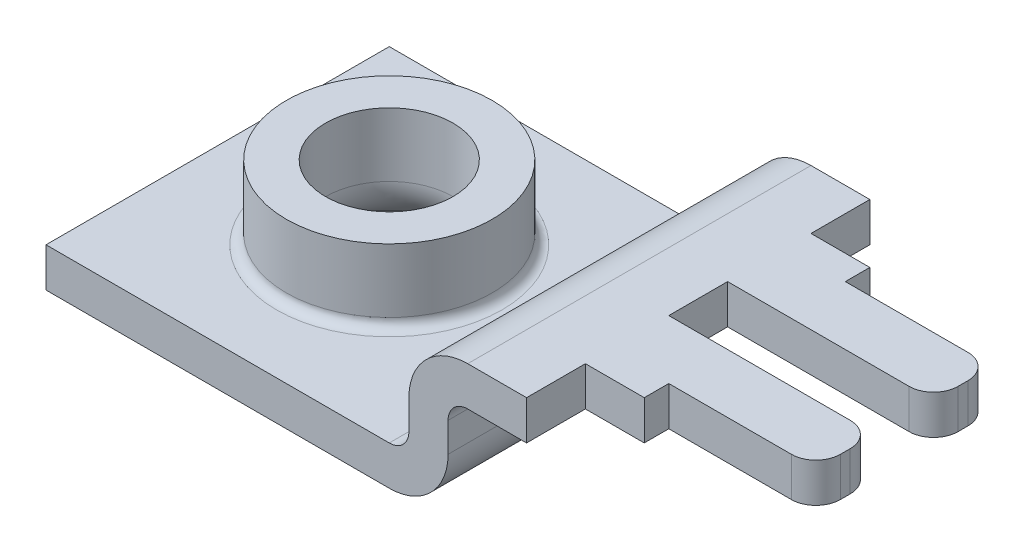
ISO-10303-21;
HEADER;
FILE_DESCRIPTION(('STEP AP214'),'2;1');
FILE_NAME('part.step','',(''),(''),'','','');
FILE_SCHEMA(('AUTOMOTIVE_DESIGN { 1 0 10303 214 1 1 1 1 }'));
ENDSEC;
DATA;
#1=APPLICATION_CONTEXT('core data for automotive mechanical design processes');
#2=APPLICATION_PROTOCOL_DEFINITION('international standard','automotive_design',2000,#1);
#3=PRODUCT_CONTEXT('',#1,'mechanical');
#4=PRODUCT('Part','Part','',(#3));
#5=PRODUCT_RELATED_PRODUCT_CATEGORY('part','',(#4));
#6=PRODUCT_DEFINITION_FORMATION('','',#4);
#7=PRODUCT_DEFINITION_CONTEXT('part definition',#1,'design');
#8=PRODUCT_DEFINITION('design','',#6,#7);
#9=PRODUCT_DEFINITION_SHAPE('','',#8);
#10=(LENGTH_UNIT() NAMED_UNIT(*) SI_UNIT(.MILLI.,.METRE.));
#11=(NAMED_UNIT(*) PLANE_ANGLE_UNIT() SI_UNIT($,.RADIAN.));
#12=(NAMED_UNIT(*) SI_UNIT($,.STERADIAN.) SOLID_ANGLE_UNIT());
#13=UNCERTAINTY_MEASURE_WITH_UNIT(LENGTH_MEASURE(1.E-05),#10,'distance_accuracy_value','');
#14=(GEOMETRIC_REPRESENTATION_CONTEXT(3) GLOBAL_UNCERTAINTY_ASSIGNED_CONTEXT((#13)) GLOBAL_UNIT_ASSIGNED_CONTEXT((#10,
#11,#12)) REPRESENTATION_CONTEXT('',''));
#15=CARTESIAN_POINT('',(0.,0.,0.));
#16=DIRECTION('',(0.,0.,1.));
#17=DIRECTION('',(1.,0.,0.));
#18=AXIS2_PLACEMENT_3D('',#15,#16,#17);
#19=CARTESIAN_POINT('',(8.19999999999999,3.,3.5));
#20=DIRECTION('',(0.,1.,0.));
#21=DIRECTION('',(0.,0.,1.));
#22=AXIS2_PLACEMENT_3D('',#19,#20,#21);
#23=PLANE('',#22);
#24=DIRECTION('',(0.,0.,1.));
#25=VECTOR('',#24,1.);
#26=CARTESIAN_POINT('',(9.79999999999998,3.,3.5));
#27=LINE('',#26,#25);
#28=CARTESIAN_POINT('',(9.79999999999998,3.,-2.3));
#29=VERTEX_POINT('',#28);
#30=CARTESIAN_POINT('',(9.79999999999998,3.,-3.5));
#31=VERTEX_POINT('',#30);
#32=EDGE_CURVE('E513',#29,#31,#27,.F.);
#33=ORIENTED_EDGE('',*,*,#32,.T.);
#34=DIRECTION('',(1.,0.,0.));
#35=VECTOR('',#34,1.);
#36=CARTESIAN_POINT('',(8.19999999999999,3.,-3.5));
#37=LINE('',#36,#35);
#38=CARTESIAN_POINT('',(8.6,3.,-3.5));
#39=VERTEX_POINT('',#38);
#40=EDGE_CURVE('E511',#31,#39,#37,.F.);
#41=ORIENTED_EDGE('',*,*,#40,.T.);
#42=DIRECTION('',(0.,0.,1.));
#43=VECTOR('',#42,1.);
#44=CARTESIAN_POINT('',(8.6,3.,-16.8071409401118));
#45=LINE('',#44,#43);
#46=CARTESIAN_POINT('',(8.6,3.,3.5));
#47=VERTEX_POINT('',#46);
#48=EDGE_CURVE('E507',#47,#39,#45,.F.);
#49=ORIENTED_EDGE('',*,*,#48,.F.);
#50=DIRECTION('',(1.,0.,0.));
#51=VECTOR('',#50,1.);
#52=CARTESIAN_POINT('',(8.19999999999999,3.,3.5));
#53=LINE('',#52,#51);
#54=CARTESIAN_POINT('',(9.79999999999998,3.,3.5));
#55=VERTEX_POINT('',#54);
#56=EDGE_CURVE('E171',#47,#55,#53,.T.);
#57=ORIENTED_EDGE('',*,*,#56,.T.);
#58=DIRECTION('',(0.,0.,1.));
#59=VECTOR('',#58,1.);
#60=CARTESIAN_POINT('',(9.79999999999998,3.,3.5));
#61=LINE('',#60,#59);
#62=CARTESIAN_POINT('',(9.79999999999998,3.,2.3));
#63=VERTEX_POINT('',#62);
#64=EDGE_CURVE('E443',#55,#63,#61,.F.);
#65=ORIENTED_EDGE('',*,*,#64,.T.);
#66=DIRECTION('',(-1.,0.,0.));
#67=VECTOR('',#66,1.);
#68=CARTESIAN_POINT('',(8.19999999999999,3.,2.3));
#69=LINE('',#68,#67);
#70=CARTESIAN_POINT('',(11.,3.,2.3));
#71=VERTEX_POINT('',#70);
#72=EDGE_CURVE('E433',#63,#71,#69,.F.);
#73=ORIENTED_EDGE('',*,*,#72,.T.);
#74=DIRECTION('',(0.,0.,1.));
#75=VECTOR('',#74,1.);
#76=CARTESIAN_POINT('',(11.,3.,3.5));
#77=LINE('',#76,#75);
#78=CARTESIAN_POINT('',(11.,3.,1.8));
#79=VERTEX_POINT('',#78);
#80=EDGE_CURVE('E422',#71,#79,#77,.F.);
#81=ORIENTED_EDGE('',*,*,#80,.T.);
#82=DIRECTION('',(-1.,0.,0.));
#83=VECTOR('',#82,1.);
#84=CARTESIAN_POINT('',(8.19999999999999,3.,1.8));
#85=LINE('',#84,#83);
#86=CARTESIAN_POINT('',(13.5,3.,1.8));
#87=VERTEX_POINT('',#86);
#88=EDGE_CURVE('E421',#79,#87,#85,.F.);
#89=ORIENTED_EDGE('',*,*,#88,.T.);
#90=CARTESIAN_POINT('',(13.5,3.,1.3));
#91=DIRECTION('',(0.,1.,0.));
#92=DIRECTION('',(0.,0.,1.));
#93=AXIS2_PLACEMENT_3D('',#90,#91,#92);
#94=CIRCLE('',#93,0.5);
#95=CARTESIAN_POINT('',(14.,3.,1.3));
#96=VERTEX_POINT('',#95);
#97=EDGE_CURVE('E417',#96,#87,#94,.F.);
#98=ORIENTED_EDGE('',*,*,#97,.F.);
#99=DIRECTION('',(0.,0.,-1.));
#100=VECTOR('',#99,1.);
#101=CARTESIAN_POINT('',(14.,3.,3.5));
#102=LINE('',#101,#100);
#103=CARTESIAN_POINT('',(14.,3.,1.1));
#104=VERTEX_POINT('',#103);
#105=EDGE_CURVE('E414',#104,#96,#102,.F.);
#106=ORIENTED_EDGE('',*,*,#105,.F.);
#107=CARTESIAN_POINT('',(13.5,3.,1.1));
#108=DIRECTION('',(0.,1.,0.));
#109=DIRECTION('',(0.,0.,1.));
#110=AXIS2_PLACEMENT_3D('',#107,#108,#109);
#111=CIRCLE('',#110,0.5);
#112=CARTESIAN_POINT('',(13.5,3.,0.600000000000002));
#113=VERTEX_POINT('',#112);
#114=EDGE_CURVE('E411',#113,#104,#111,.F.);
#115=ORIENTED_EDGE('',*,*,#114,.F.);
#116=DIRECTION('',(1.,0.,0.));
#117=VECTOR('',#116,1.);
#118=CARTESIAN_POINT('',(8.19999999999999,3.,0.600000000000003));
#119=LINE('',#118,#117);
#120=CARTESIAN_POINT('',(9.79999999999998,3.,0.600000000000003));
#121=VERTEX_POINT('',#120);
#122=EDGE_CURVE('E403',#113,#121,#119,.F.);
#123=ORIENTED_EDGE('',*,*,#122,.T.);
#124=DIRECTION('',(0.,0.,1.));
#125=VECTOR('',#124,1.);
#126=CARTESIAN_POINT('',(9.79999999999998,3.,3.5));
#127=LINE('',#126,#125);
#128=CARTESIAN_POINT('',(9.79999999999998,3.,-0.600000000000003));
#129=VERTEX_POINT('',#128);
#130=EDGE_CURVE('E393',#121,#129,#127,.F.);
#131=ORIENTED_EDGE('',*,*,#130,.T.);
#132=DIRECTION('',(-1.,0.,0.));
#133=VECTOR('',#132,1.);
#134=CARTESIAN_POINT('',(8.19999999999999,3.,-0.600000000000003));
#135=LINE('',#134,#133);
#136=CARTESIAN_POINT('',(13.5,3.,-0.600000000000003));
#137=VERTEX_POINT('',#136);
#138=EDGE_CURVE('E392',#129,#137,#135,.F.);
#139=ORIENTED_EDGE('',*,*,#138,.T.);
#140=CARTESIAN_POINT('',(13.5,3.,-1.1));
#141=DIRECTION('',(0.,1.,0.));
#142=DIRECTION('',(0.,0.,1.));
#143=AXIS2_PLACEMENT_3D('',#140,#141,#142);
#144=CIRCLE('',#143,0.5);
#145=CARTESIAN_POINT('',(14.,3.,-1.1));
#146=VERTEX_POINT('',#145);
#147=EDGE_CURVE('E388',#146,#137,#144,.F.);
#148=ORIENTED_EDGE('',*,*,#147,.F.);
#149=DIRECTION('',(0.,0.,-1.));
#150=VECTOR('',#149,1.);
#151=CARTESIAN_POINT('',(14.,3.,3.5));
#152=LINE('',#151,#150);
#153=CARTESIAN_POINT('',(14.,3.,-1.3));
#154=VERTEX_POINT('',#153);
#155=EDGE_CURVE('E385',#154,#146,#152,.F.);
#156=ORIENTED_EDGE('',*,*,#155,.F.);
#157=CARTESIAN_POINT('',(13.5,3.,-1.3));
#158=DIRECTION('',(0.,1.,0.));
#159=DIRECTION('',(0.,0.,1.));
#160=AXIS2_PLACEMENT_3D('',#157,#158,#159);
#161=CIRCLE('',#160,0.5);
#162=CARTESIAN_POINT('',(13.5,3.,-1.8));
#163=VERTEX_POINT('',#162);
#164=EDGE_CURVE('E382',#163,#154,#161,.F.);
#165=ORIENTED_EDGE('',*,*,#164,.F.);
#166=DIRECTION('',(1.,0.,0.));
#167=VECTOR('',#166,1.);
#168=CARTESIAN_POINT('',(8.19999999999999,3.,-1.8));
#169=LINE('',#168,#167);
#170=CARTESIAN_POINT('',(11.,3.,-1.8));
#171=VERTEX_POINT('',#170);
#172=EDGE_CURVE('E369',#163,#171,#169,.F.);
#173=ORIENTED_EDGE('',*,*,#172,.T.);
#174=DIRECTION('',(0.,0.,1.));
#175=VECTOR('',#174,1.);
#176=CARTESIAN_POINT('',(11.,3.,3.5));
#177=LINE('',#176,#175);
#178=CARTESIAN_POINT('',(11.,3.,-2.3));
#179=VERTEX_POINT('',#178);
#180=EDGE_CURVE('E471',#171,#179,#177,.F.);
#181=ORIENTED_EDGE('',*,*,#180,.T.);
#182=DIRECTION('',(1.,0.,0.));
#183=VECTOR('',#182,1.);
#184=CARTESIAN_POINT('',(8.19999999999999,3.,-2.3));
#185=LINE('',#184,#183);
#186=EDGE_CURVE('E474',#179,#29,#185,.F.);
#187=ORIENTED_EDGE('',*,*,#186,.T.);
#188=EDGE_LOOP('',(#33,#41,#49,#57,#65,#73,#81,#89,#98,#106,#115,#123,#131,#139,#148,#156,#165,
#173,#181,#187));
#189=FACE_BOUND('',#188,.T.);
#190=ADVANCED_FACE('F17',(#189),#23,.T.);
#191=CARTESIAN_POINT('',(8.6,1.8,-16.8071409401118));
#192=DIRECTION('',(0.,0.,1.));
#193=DIRECTION('',(1.,0.,0.));
#194=AXIS2_PLACEMENT_3D('',#191,#192,#193);
#195=CYLINDRICAL_SURFACE('',#194,1.2);
#196=CARTESIAN_POINT('',(8.6,1.8,-3.5));
#197=DIRECTION('',(0.,0.,1.));
#198=DIRECTION('',(1.,0.,0.));
#199=AXIS2_PLACEMENT_3D('',#196,#197,#198);
#200=CIRCLE('',#199,1.2);
#201=CARTESIAN_POINT('',(7.40000000000001,1.8,-3.5));
#202=VERTEX_POINT('',#201);
#203=EDGE_CURVE('E464',#39,#202,#200,.T.);
#204=ORIENTED_EDGE('',*,*,#203,.T.);
#205=DIRECTION('',(0.,0.,1.));
#206=VECTOR('',#205,1.);
#207=CARTESIAN_POINT('',(7.40000000000002,1.8,3.5));
#208=LINE('',#207,#206);
#209=CARTESIAN_POINT('',(7.40000000000001,1.8,3.5));
#210=VERTEX_POINT('',#209);
#211=EDGE_CURVE('E361',#210,#202,#208,.F.);
#212=ORIENTED_EDGE('',*,*,#211,.F.);
#213=CARTESIAN_POINT('',(8.6,1.8,3.49999999999999));
#214=DIRECTION('',(0.,0.,1.));
#215=DIRECTION('',(1.,0.,0.));
#216=AXIS2_PLACEMENT_3D('',#213,#214,#215);
#217=CIRCLE('',#216,1.2);
#218=EDGE_CURVE('E510',#210,#47,#217,.F.);
#219=ORIENTED_EDGE('',*,*,#218,.T.);
#220=ORIENTED_EDGE('',*,*,#48,.T.);
#221=EDGE_LOOP('',(#204,#212,#219,#220));
#222=FACE_BOUND('',#221,.T.);
#223=ADVANCED_FACE('F566',(#222),#195,.T.);
#224=CARTESIAN_POINT('',(9.79999999999998,-14.6816288842403,3.5));
#225=DIRECTION('',(-1.,0.,0.));
#226=DIRECTION('',(0.,0.,1.));
#227=AXIS2_PLACEMENT_3D('',#224,#225,#226);
#228=PLANE('',#227);
#229=DIRECTION('',(0.,1.,0.));
#230=VECTOR('',#229,1.);
#231=CARTESIAN_POINT('',(9.79999999999998,-14.6816288842403,3.5));
#232=LINE('',#231,#230);
#233=CARTESIAN_POINT('',(9.79999999999998,2.19999999999999,3.5));
#234=VERTEX_POINT('',#233);
#235=EDGE_CURVE('E450',#234,#55,#232,.T.);
#236=ORIENTED_EDGE('',*,*,#235,.F.);
#237=DIRECTION('',(0.,0.,1.));
#238=VECTOR('',#237,1.);
#239=CARTESIAN_POINT('',(9.79999999999998,2.19999999999999,3.5));
#240=LINE('',#239,#238);
#241=CARTESIAN_POINT('',(9.79999999999998,2.19999999999999,2.3));
#242=VERTEX_POINT('',#241);
#243=EDGE_CURVE('E358',#234,#242,#240,.F.);
#244=ORIENTED_EDGE('',*,*,#243,.T.);
#245=DIRECTION('',(0.,1.,0.));
#246=VECTOR('',#245,1.);
#247=CARTESIAN_POINT('',(9.79999999999998,-14.6816288842403,2.3));
#248=LINE('',#247,#246);
#249=EDGE_CURVE('E440',#242,#63,#248,.T.);
#250=ORIENTED_EDGE('',*,*,#249,.T.);
#251=ORIENTED_EDGE('',*,*,#64,.F.);
#252=EDGE_LOOP('',(#236,#244,#250,#251));
#253=FACE_BOUND('',#252,.T.);
#254=ADVANCED_FACE('F635',(#253),#228,.F.);
#255=CARTESIAN_POINT('',(8.19999999999999,-14.6816288842403,2.3));
#256=DIRECTION('',(0.,0.,-1.));
#257=DIRECTION('',(-1.,0.,0.));
#258=AXIS2_PLACEMENT_3D('',#255,#256,#257);
#259=PLANE('',#258);
#260=ORIENTED_EDGE('',*,*,#249,.F.);
#261=DIRECTION('',(1.,0.,0.));
#262=VECTOR('',#261,1.);
#263=CARTESIAN_POINT('',(8.19999999999999,2.19999999999999,2.3));
#264=LINE('',#263,#262);
#265=CARTESIAN_POINT('',(11.,2.19999999999999,2.3));
#266=VERTEX_POINT('',#265);
#267=EDGE_CURVE('E427',#242,#266,#264,.T.);
#268=ORIENTED_EDGE('',*,*,#267,.T.);
#269=DIRECTION('',(0.,1.,0.));
#270=VECTOR('',#269,1.);
#271=CARTESIAN_POINT('',(11.,-14.6816288842403,2.3));
#272=LINE('',#271,#270);
#273=EDGE_CURVE('E430',#266,#71,#272,.T.);
#274=ORIENTED_EDGE('',*,*,#273,.T.);
#275=ORIENTED_EDGE('',*,*,#72,.F.);
#276=EDGE_LOOP('',(#260,#268,#274,#275));
#277=FACE_BOUND('',#276,.T.);
#278=ADVANCED_FACE('F629',(#277),#259,.F.);
#279=CARTESIAN_POINT('',(11.,-14.6816288842403,3.5));
#280=DIRECTION('',(-1.,0.,0.));
#281=DIRECTION('',(0.,0.,1.));
#282=AXIS2_PLACEMENT_3D('',#279,#280,#281);
#283=PLANE('',#282);
#284=ORIENTED_EDGE('',*,*,#273,.F.);
#285=DIRECTION('',(0.,0.,1.));
#286=VECTOR('',#285,1.);
#287=CARTESIAN_POINT('',(11.,2.19999999999999,3.5));
#288=LINE('',#287,#286);
#289=CARTESIAN_POINT('',(11.,2.19999999999999,1.8));
#290=VERTEX_POINT('',#289);
#291=EDGE_CURVE('E347',#266,#290,#288,.F.);
#292=ORIENTED_EDGE('',*,*,#291,.T.);
#293=DIRECTION('',(0.,1.,0.));
#294=VECTOR('',#293,1.);
#295=CARTESIAN_POINT('',(11.,-14.6816288842403,1.8));
#296=LINE('',#295,#294);
#297=EDGE_CURVE('E418',#290,#79,#296,.T.);
#298=ORIENTED_EDGE('',*,*,#297,.T.);
#299=ORIENTED_EDGE('',*,*,#80,.F.);
#300=EDGE_LOOP('',(#284,#292,#298,#299));
#301=FACE_BOUND('',#300,.T.);
#302=ADVANCED_FACE('F736',(#301),#283,.F.);
#303=CARTESIAN_POINT('',(8.19999999999999,-14.6816288842403,1.8));
#304=DIRECTION('',(0.,0.,-1.));
#305=DIRECTION('',(-1.,0.,0.));
#306=AXIS2_PLACEMENT_3D('',#303,#304,#305);
#307=PLANE('',#306);
#308=ORIENTED_EDGE('',*,*,#297,.F.);
#309=DIRECTION('',(1.,0.,0.));
#310=VECTOR('',#309,1.);
#311=CARTESIAN_POINT('',(8.19999999999999,2.19999999999999,1.8));
#312=LINE('',#311,#310);
#313=CARTESIAN_POINT('',(13.5,2.19999999999999,1.8));
#314=VERTEX_POINT('',#313);
#315=EDGE_CURVE('E344',#290,#314,#312,.T.);
#316=ORIENTED_EDGE('',*,*,#315,.T.);
#317=DIRECTION('',(0.,1.,0.));
#318=VECTOR('',#317,1.);
#319=CARTESIAN_POINT('',(13.5,-14.6816288842403,1.8));
#320=LINE('',#319,#318);
#321=EDGE_CURVE('E415',#87,#314,#320,.F.);
#322=ORIENTED_EDGE('',*,*,#321,.F.);
#323=ORIENTED_EDGE('',*,*,#88,.F.);
#324=EDGE_LOOP('',(#308,#316,#322,#323));
#325=FACE_BOUND('',#324,.T.);
#326=ADVANCED_FACE('F732',(#325),#307,.F.);
#327=CARTESIAN_POINT('',(13.5,-14.6816288842403,1.3));
#328=DIRECTION('',(0.,1.,0.));
#329=DIRECTION('',(0.,0.,1.));
#330=AXIS2_PLACEMENT_3D('',#327,#328,#329);
#331=CYLINDRICAL_SURFACE('',#330,0.5);
#332=CARTESIAN_POINT('',(13.5,2.19999999999999,1.3));
#333=DIRECTION('',(0.,1.,0.));
#334=DIRECTION('',(0.,0.,1.));
#335=AXIS2_PLACEMENT_3D('',#332,#333,#334);
#336=CIRCLE('',#335,0.5);
#337=CARTESIAN_POINT('',(14.,2.19999999999999,1.3));
#338=VERTEX_POINT('',#337);
#339=EDGE_CURVE('E343',#314,#338,#336,.T.);
#340=ORIENTED_EDGE('',*,*,#339,.T.);
#341=DIRECTION('',(0.,1.,0.));
#342=VECTOR('',#341,1.);
#343=CARTESIAN_POINT('',(14.,-14.6816288842403,1.3));
#344=LINE('',#343,#342);
#345=EDGE_CURVE('E412',#96,#338,#344,.F.);
#346=ORIENTED_EDGE('',*,*,#345,.F.);
#347=ORIENTED_EDGE('',*,*,#97,.T.);
#348=ORIENTED_EDGE('',*,*,#321,.T.);
#349=EDGE_LOOP('',(#340,#346,#347,#348));
#350=FACE_BOUND('',#349,.T.);
#351=ADVANCED_FACE('F728',(#350),#331,.T.);
#352=CARTESIAN_POINT('',(14.,-14.6816288842403,3.5));
#353=DIRECTION('',(1.,0.,0.));
#354=DIRECTION('',(0.,0.,-1.));
#355=AXIS2_PLACEMENT_3D('',#352,#353,#354);
#356=PLANE('',#355);
#357=ORIENTED_EDGE('',*,*,#345,.T.);
#358=DIRECTION('',(0.,0.,1.));
#359=VECTOR('',#358,1.);
#360=CARTESIAN_POINT('',(14.,2.19999999999999,3.5));
#361=LINE('',#360,#359);
#362=CARTESIAN_POINT('',(14.,2.19999999999999,1.1));
#363=VERTEX_POINT('',#362);
#364=EDGE_CURVE('E340',#338,#363,#361,.F.);
#365=ORIENTED_EDGE('',*,*,#364,.T.);
#366=DIRECTION('',(0.,1.,0.));
#367=VECTOR('',#366,1.);
#368=CARTESIAN_POINT('',(14.,-14.6816288842403,1.1));
#369=LINE('',#368,#367);
#370=EDGE_CURVE('E409',#104,#363,#369,.F.);
#371=ORIENTED_EDGE('',*,*,#370,.F.);
#372=ORIENTED_EDGE('',*,*,#105,.T.);
#373=EDGE_LOOP('',(#357,#365,#371,#372));
#374=FACE_BOUND('',#373,.T.);
#375=ADVANCED_FACE('F724',(#374),#356,.T.);
#376=CARTESIAN_POINT('',(13.5,-14.6816288842403,1.1));
#377=DIRECTION('',(0.,1.,0.));
#378=DIRECTION('',(0.,0.,1.));
#379=AXIS2_PLACEMENT_3D('',#376,#377,#378);
#380=CYLINDRICAL_SURFACE('',#379,0.5);
#381=CARTESIAN_POINT('',(13.5,2.19999999999999,1.1));
#382=DIRECTION('',(0.,1.,0.));
#383=DIRECTION('',(0.,0.,1.));
#384=AXIS2_PLACEMENT_3D('',#381,#382,#383);
#385=CIRCLE('',#384,0.5);
#386=CARTESIAN_POINT('',(13.5,2.19999999999999,0.600000000000003));
#387=VERTEX_POINT('',#386);
#388=EDGE_CURVE('E337',#363,#387,#385,.T.);
#389=ORIENTED_EDGE('',*,*,#388,.T.);
#390=DIRECTION('',(0.,1.,0.));
#391=VECTOR('',#390,1.);
#392=CARTESIAN_POINT('',(13.5,-14.6816288842403,0.600000000000002));
#393=LINE('',#392,#391);
#394=EDGE_CURVE('E406',#387,#113,#393,.T.);
#395=ORIENTED_EDGE('',*,*,#394,.T.);
#396=ORIENTED_EDGE('',*,*,#114,.T.);
#397=ORIENTED_EDGE('',*,*,#370,.T.);
#398=EDGE_LOOP('',(#389,#395,#396,#397));
#399=FACE_BOUND('',#398,.T.);
#400=ADVANCED_FACE('F720',(#399),#380,.T.);
#401=CARTESIAN_POINT('',(8.19999999999999,-14.6816288842403,0.600000000000003));
#402=DIRECTION('',(0.,0.,1.));
#403=DIRECTION('',(1.,0.,0.));
#404=AXIS2_PLACEMENT_3D('',#401,#402,#403);
#405=PLANE('',#404);
#406=ORIENTED_EDGE('',*,*,#394,.F.);
#407=DIRECTION('',(1.,0.,0.));
#408=VECTOR('',#407,1.);
#409=CARTESIAN_POINT('',(8.19999999999999,2.19999999999999,0.600000000000003));
#410=LINE('',#409,#408);
#411=CARTESIAN_POINT('',(9.79999999999998,2.19999999999999,0.600000000000003));
#412=VERTEX_POINT('',#411);
#413=EDGE_CURVE('E334',#387,#412,#410,.F.);
#414=ORIENTED_EDGE('',*,*,#413,.T.);
#415=DIRECTION('',(0.,1.,0.));
#416=VECTOR('',#415,1.);
#417=CARTESIAN_POINT('',(9.79999999999998,-14.6816288842403,0.600000000000003));
#418=LINE('',#417,#416);
#419=EDGE_CURVE('E400',#412,#121,#418,.T.);
#420=ORIENTED_EDGE('',*,*,#419,.T.);
#421=ORIENTED_EDGE('',*,*,#122,.F.);
#422=EDGE_LOOP('',(#406,#414,#420,#421));
#423=FACE_BOUND('',#422,.T.);
#424=ADVANCED_FACE('F716',(#423),#405,.F.);
#425=CARTESIAN_POINT('',(9.79999999999998,-14.6816288842403,3.5));
#426=DIRECTION('',(-1.,0.,0.));
#427=DIRECTION('',(0.,0.,1.));
#428=AXIS2_PLACEMENT_3D('',#425,#426,#427);
#429=PLANE('',#428);
#430=ORIENTED_EDGE('',*,*,#419,.F.);
#431=DIRECTION('',(0.,0.,1.));
#432=VECTOR('',#431,1.);
#433=CARTESIAN_POINT('',(9.79999999999998,2.19999999999999,3.5));
#434=LINE('',#433,#432);
#435=CARTESIAN_POINT('',(9.79999999999998,2.19999999999999,-0.600000000000003));
#436=VERTEX_POINT('',#435);
#437=EDGE_CURVE('E331',#412,#436,#434,.F.);
#438=ORIENTED_EDGE('',*,*,#437,.T.);
#439=DIRECTION('',(0.,1.,0.));
#440=VECTOR('',#439,1.);
#441=CARTESIAN_POINT('',(9.79999999999998,-14.6816288842403,-0.600000000000003));
#442=LINE('',#441,#440);
#443=EDGE_CURVE('E389',#436,#129,#442,.T.);
#444=ORIENTED_EDGE('',*,*,#443,.T.);
#445=ORIENTED_EDGE('',*,*,#130,.F.);
#446=EDGE_LOOP('',(#430,#438,#444,#445));
#447=FACE_BOUND('',#446,.T.);
#448=ADVANCED_FACE('F712',(#447),#429,.F.);
#449=CARTESIAN_POINT('',(8.19999999999999,-14.6816288842403,-0.600000000000003));
#450=DIRECTION('',(0.,0.,-1.));
#451=DIRECTION('',(-1.,0.,0.));
#452=AXIS2_PLACEMENT_3D('',#449,#450,#451);
#453=PLANE('',#452);
#454=ORIENTED_EDGE('',*,*,#443,.F.);
#455=DIRECTION('',(1.,0.,0.));
#456=VECTOR('',#455,1.);
#457=CARTESIAN_POINT('',(8.19999999999999,2.19999999999999,-0.600000000000003));
#458=LINE('',#457,#456);
#459=CARTESIAN_POINT('',(13.5,2.19999999999999,-0.600000000000004));
#460=VERTEX_POINT('',#459);
#461=EDGE_CURVE('E328',#436,#460,#458,.T.);
#462=ORIENTED_EDGE('',*,*,#461,.T.);
#463=DIRECTION('',(0.,1.,0.));
#464=VECTOR('',#463,1.);
#465=CARTESIAN_POINT('',(13.5,-14.6816288842403,-0.600000000000004));
#466=LINE('',#465,#464);
#467=EDGE_CURVE('E386',#137,#460,#466,.F.);
#468=ORIENTED_EDGE('',*,*,#467,.F.);
#469=ORIENTED_EDGE('',*,*,#138,.F.);
#470=EDGE_LOOP('',(#454,#462,#468,#469));
#471=FACE_BOUND('',#470,.T.);
#472=ADVANCED_FACE('F708',(#471),#453,.F.);
#473=CARTESIAN_POINT('',(13.5,-14.6816288842403,-1.1));
#474=DIRECTION('',(0.,1.,0.));
#475=DIRECTION('',(0.,0.,1.));
#476=AXIS2_PLACEMENT_3D('',#473,#474,#475);
#477=CYLINDRICAL_SURFACE('',#476,0.5);
#478=CARTESIAN_POINT('',(13.5,2.19999999999999,-1.1));
#479=DIRECTION('',(0.,1.,0.));
#480=DIRECTION('',(0.,0.,1.));
#481=AXIS2_PLACEMENT_3D('',#478,#479,#480);
#482=CIRCLE('',#481,0.5);
#483=CARTESIAN_POINT('',(14.,2.19999999999999,-1.1));
#484=VERTEX_POINT('',#483);
#485=EDGE_CURVE('E327',#460,#484,#482,.T.);
#486=ORIENTED_EDGE('',*,*,#485,.T.);
#487=DIRECTION('',(0.,1.,0.));
#488=VECTOR('',#487,1.);
#489=CARTESIAN_POINT('',(14.,-14.6816288842403,-1.1));
#490=LINE('',#489,#488);
#491=EDGE_CURVE('E383',#146,#484,#490,.F.);
#492=ORIENTED_EDGE('',*,*,#491,.F.);
#493=ORIENTED_EDGE('',*,*,#147,.T.);
#494=ORIENTED_EDGE('',*,*,#467,.T.);
#495=EDGE_LOOP('',(#486,#492,#493,#494));
#496=FACE_BOUND('',#495,.T.);
#497=ADVANCED_FACE('F704',(#496),#477,.T.);
#498=CARTESIAN_POINT('',(14.,-14.6816288842403,3.5));
#499=DIRECTION('',(1.,0.,0.));
#500=DIRECTION('',(0.,0.,-1.));
#501=AXIS2_PLACEMENT_3D('',#498,#499,#500);
#502=PLANE('',#501);
#503=ORIENTED_EDGE('',*,*,#491,.T.);
#504=DIRECTION('',(0.,0.,1.));
#505=VECTOR('',#504,1.);
#506=CARTESIAN_POINT('',(14.,2.19999999999999,3.5));
#507=LINE('',#506,#505);
#508=CARTESIAN_POINT('',(14.,2.19999999999999,-1.3));
#509=VERTEX_POINT('',#508);
#510=EDGE_CURVE('E324',#484,#509,#507,.F.);
#511=ORIENTED_EDGE('',*,*,#510,.T.);
#512=DIRECTION('',(0.,1.,0.));
#513=VECTOR('',#512,1.);
#514=CARTESIAN_POINT('',(14.,-14.6816288842403,-1.3));
#515=LINE('',#514,#513);
#516=EDGE_CURVE('E370',#154,#509,#515,.F.);
#517=ORIENTED_EDGE('',*,*,#516,.F.);
#518=ORIENTED_EDGE('',*,*,#155,.T.);
#519=EDGE_LOOP('',(#503,#511,#517,#518));
#520=FACE_BOUND('',#519,.T.);
#521=ADVANCED_FACE('F700',(#520),#502,.T.);
#522=CARTESIAN_POINT('',(13.5,-14.6816288842403,-1.3));
#523=DIRECTION('',(0.,1.,0.));
#524=DIRECTION('',(0.,0.,1.));
#525=AXIS2_PLACEMENT_3D('',#522,#523,#524);
#526=CYLINDRICAL_SURFACE('',#525,0.5);
#527=CARTESIAN_POINT('',(13.5,2.19999999999999,-1.3));
#528=DIRECTION('',(0.,1.,0.));
#529=DIRECTION('',(0.,0.,1.));
#530=AXIS2_PLACEMENT_3D('',#527,#528,#529);
#531=CIRCLE('',#530,0.5);
#532=CARTESIAN_POINT('',(13.5,2.19999999999999,-1.8));
#533=VERTEX_POINT('',#532);
#534=EDGE_CURVE('E321',#509,#533,#531,.T.);
#535=ORIENTED_EDGE('',*,*,#534,.T.);
#536=DIRECTION('',(0.,1.,0.));
#537=VECTOR('',#536,1.);
#538=CARTESIAN_POINT('',(13.5,-14.6816288842403,-1.8));
#539=LINE('',#538,#537);
#540=EDGE_CURVE('E366',#533,#163,#539,.T.);
#541=ORIENTED_EDGE('',*,*,#540,.T.);
#542=ORIENTED_EDGE('',*,*,#164,.T.);
#543=ORIENTED_EDGE('',*,*,#516,.T.);
#544=EDGE_LOOP('',(#535,#541,#542,#543));
#545=FACE_BOUND('',#544,.T.);
#546=ADVANCED_FACE('F696',(#545),#526,.T.);
#547=CARTESIAN_POINT('',(8.19999999999999,-14.6816288842403,-1.8));
#548=DIRECTION('',(0.,0.,1.));
#549=DIRECTION('',(1.,0.,0.));
#550=AXIS2_PLACEMENT_3D('',#547,#548,#549);
#551=PLANE('',#550);
#552=ORIENTED_EDGE('',*,*,#540,.F.);
#553=DIRECTION('',(1.,0.,0.));
#554=VECTOR('',#553,1.);
#555=CARTESIAN_POINT('',(8.19999999999999,2.19999999999999,-1.8));
#556=LINE('',#555,#554);
#557=CARTESIAN_POINT('',(11.,2.19999999999999,-1.8));
#558=VERTEX_POINT('',#557);
#559=EDGE_CURVE('E318',#533,#558,#556,.F.);
#560=ORIENTED_EDGE('',*,*,#559,.T.);
#561=DIRECTION('',(0.,1.,0.));
#562=VECTOR('',#561,1.);
#563=CARTESIAN_POINT('',(11.,-14.6816288842403,-1.8));
#564=LINE('',#563,#562);
#565=EDGE_CURVE('E375',#558,#171,#564,.T.);
#566=ORIENTED_EDGE('',*,*,#565,.T.);
#567=ORIENTED_EDGE('',*,*,#172,.F.);
#568=EDGE_LOOP('',(#552,#560,#566,#567));
#569=FACE_BOUND('',#568,.T.);
#570=ADVANCED_FACE('F692',(#569),#551,.F.);
#571=CARTESIAN_POINT('',(11.,-14.6816288842403,3.5));
#572=DIRECTION('',(-1.,0.,0.));
#573=DIRECTION('',(0.,0.,1.));
#574=AXIS2_PLACEMENT_3D('',#571,#572,#573);
#575=PLANE('',#574);
#576=ORIENTED_EDGE('',*,*,#565,.F.);
#577=DIRECTION('',(0.,0.,1.));
#578=VECTOR('',#577,1.);
#579=CARTESIAN_POINT('',(11.,2.19999999999999,3.5));
#580=LINE('',#579,#578);
#581=CARTESIAN_POINT('',(11.,2.19999999999999,-2.3));
#582=VERTEX_POINT('',#581);
#583=EDGE_CURVE('E317',#558,#582,#580,.F.);
#584=ORIENTED_EDGE('',*,*,#583,.T.);
#585=DIRECTION('',(0.,1.,0.));
#586=VECTOR('',#585,1.);
#587=CARTESIAN_POINT('',(11.,-14.6816288842403,-2.3));
#588=LINE('',#587,#586);
#589=EDGE_CURVE('E378',#582,#179,#588,.T.);
#590=ORIENTED_EDGE('',*,*,#589,.T.);
#591=ORIENTED_EDGE('',*,*,#180,.F.);
#592=EDGE_LOOP('',(#576,#584,#590,#591));
#593=FACE_BOUND('',#592,.T.);
#594=ADVANCED_FACE('F688',(#593),#575,.F.);
#595=CARTESIAN_POINT('',(8.19999999999999,-14.6816288842403,-2.3));
#596=DIRECTION('',(0.,0.,1.));
#597=DIRECTION('',(1.,0.,0.));
#598=AXIS2_PLACEMENT_3D('',#595,#596,#597);
#599=PLANE('',#598);
#600=ORIENTED_EDGE('',*,*,#589,.F.);
#601=DIRECTION('',(1.,0.,0.));
#602=VECTOR('',#601,1.);
#603=CARTESIAN_POINT('',(8.19999999999999,2.19999999999999,-2.3));
#604=LINE('',#603,#602);
#605=CARTESIAN_POINT('',(9.79999999999998,2.19999999999999,-2.3));
#606=VERTEX_POINT('',#605);
#607=EDGE_CURVE('E314',#582,#606,#604,.F.);
#608=ORIENTED_EDGE('',*,*,#607,.T.);
#609=DIRECTION('',(0.,1.,0.));
#610=VECTOR('',#609,1.);
#611=CARTESIAN_POINT('',(9.79999999999998,-14.6816288842403,-2.3));
#612=LINE('',#611,#610);
#613=EDGE_CURVE('E518',#606,#29,#612,.T.);
#614=ORIENTED_EDGE('',*,*,#613,.T.);
#615=ORIENTED_EDGE('',*,*,#186,.F.);
#616=EDGE_LOOP('',(#600,#608,#614,#615));
#617=FACE_BOUND('',#616,.T.);
#618=ADVANCED_FACE('F684',(#617),#599,.F.);
#619=CARTESIAN_POINT('',(9.79999999999998,-14.6816288842403,3.5));
#620=DIRECTION('',(-1.,0.,0.));
#621=DIRECTION('',(0.,0.,1.));
#622=AXIS2_PLACEMENT_3D('',#619,#620,#621);
#623=PLANE('',#622);
#624=ORIENTED_EDGE('',*,*,#613,.F.);
#625=DIRECTION('',(0.,0.,1.));
#626=VECTOR('',#625,1.);
#627=CARTESIAN_POINT('',(9.79999999999998,2.19999999999999,3.5));
#628=LINE('',#627,#626);
#629=CARTESIAN_POINT('',(9.79999999999998,2.19999999999999,-3.5));
#630=VERTEX_POINT('',#629);
#631=EDGE_CURVE('E305',#606,#630,#628,.F.);
#632=ORIENTED_EDGE('',*,*,#631,.T.);
#633=DIRECTION('',(0.,1.,0.));
#634=VECTOR('',#633,1.);
#635=CARTESIAN_POINT('',(9.79999999999998,-14.6816288842403,-3.5));
#636=LINE('',#635,#634);
#637=EDGE_CURVE('E453',#630,#31,#636,.T.);
#638=ORIENTED_EDGE('',*,*,#637,.T.);
#639=ORIENTED_EDGE('',*,*,#32,.F.);
#640=EDGE_LOOP('',(#624,#632,#638,#639));
#641=FACE_BOUND('',#640,.T.);
#642=ADVANCED_FACE('F678',(#641),#623,.F.);
#643=CARTESIAN_POINT('',(3.5,2.30000000011368,0.));
#644=DIRECTION('',(0.,-1.,0.));
#645=DIRECTION('',(0.,0.,-1.));
#646=AXIS2_PLACEMENT_3D('',#643,#644,#645);
#647=CYLINDRICAL_SURFACE('',#646,2.1);
#648=CARTESIAN_POINT('',(3.5,2.30000000011368,0.));
#649=DIRECTION('',(0.,-1.,0.));
#650=DIRECTION('',(0.,0.,-1.));
#651=AXIS2_PLACEMENT_3D('',#648,#649,#650);
#652=CIRCLE('',#651,2.1);
#653=CARTESIAN_POINT('',(3.5,2.30000000011368,-2.1));
#654=VERTEX_POINT('',#653);
#655=EDGE_CURVE('E365',#654,#654,#652,.T.);
#656=ORIENTED_EDGE('',*,*,#655,.T.);
#657=EDGE_LOOP('',(#656));
#658=FACE_BOUND('',#657,.T.);
#659=CARTESIAN_POINT('',(3.5,1.00000000011369,0.));
#660=DIRECTION('',(0.,1.,0.));
#661=DIRECTION('',(0.,0.,-1.));
#662=AXIS2_PLACEMENT_3D('',#659,#660,#661);
#663=CIRCLE('',#662,2.1);
#664=CARTESIAN_POINT('',(3.5,1.00000000011369,-2.1));
#665=VERTEX_POINT('',#664);
#666=EDGE_CURVE('E362',#665,#665,#663,.T.);
#667=ORIENTED_EDGE('',*,*,#666,.T.);
#668=EDGE_LOOP('',(#667));
#669=FACE_BOUND('',#668,.T.);
#670=ADVANCED_FACE('F672',(#658,#669),#647,.T.);
#671=CARTESIAN_POINT('',(7.40000000000002,0.,3.5));
#672=DIRECTION('',(-1.,0.,0.));
#673=DIRECTION('',(0.,0.,1.));
#674=AXIS2_PLACEMENT_3D('',#671,#672,#673);
#675=PLANE('',#674);
#676=DIRECTION('',(0.,0.,-1.));
#677=VECTOR('',#676,1.);
#678=CARTESIAN_POINT('',(7.40000000000001,1.20000000000001,19.4978123504598));
#679=LINE('',#678,#677);
#680=CARTESIAN_POINT('',(7.40000000000001,1.20000000000001,-3.5));
#681=VERTEX_POINT('',#680);
#682=CARTESIAN_POINT('',(7.40000000000001,1.20000000000001,3.5));
#683=VERTEX_POINT('',#682);
#684=EDGE_CURVE('E350',#681,#683,#679,.F.);
#685=ORIENTED_EDGE('',*,*,#684,.T.);
#686=DIRECTION('',(0.,1.,0.));
#687=VECTOR('',#686,1.);
#688=CARTESIAN_POINT('',(7.40000000000002,0.,3.5));
#689=LINE('',#688,#687);
#690=EDGE_CURVE('E355',#683,#210,#689,.T.);
#691=ORIENTED_EDGE('',*,*,#690,.T.);
#692=ORIENTED_EDGE('',*,*,#211,.T.);
#693=DIRECTION('',(0.,1.,0.));
#694=VECTOR('',#693,1.);
#695=CARTESIAN_POINT('',(7.40000000000002,0.,-3.5));
#696=LINE('',#695,#694);
#697=EDGE_CURVE('E359',#202,#681,#696,.F.);
#698=ORIENTED_EDGE('',*,*,#697,.T.);
#699=EDGE_LOOP('',(#685,#691,#692,#698));
#700=FACE_BOUND('',#699,.T.);
#701=ADVANCED_FACE('F670',(#700),#675,.T.);
#702=CARTESIAN_POINT('',(8.19999999999999,2.19999999999999,3.5));
#703=DIRECTION('',(0.,1.,0.));
#704=DIRECTION('',(0.,0.,1.));
#705=AXIS2_PLACEMENT_3D('',#702,#703,#704);
#706=PLANE('',#705);
#707=DIRECTION('',(0.,0.,1.));
#708=VECTOR('',#707,1.);
#709=CARTESIAN_POINT('',(8.6,2.2,-16.8071409401118));
#710=LINE('',#709,#708);
#711=CARTESIAN_POINT('',(8.6,2.2,3.5));
#712=VERTEX_POINT('',#711);
#713=CARTESIAN_POINT('',(8.6,2.2,-3.5));
#714=VERTEX_POINT('',#713);
#715=EDGE_CURVE('E167',#712,#714,#710,.F.);
#716=ORIENTED_EDGE('',*,*,#715,.T.);
#717=DIRECTION('',(1.,0.,0.));
#718=VECTOR('',#717,1.);
#719=CARTESIAN_POINT('',(8.19999999999999,2.19999999999999,-3.5));
#720=LINE('',#719,#718);
#721=EDGE_CURVE('E313',#630,#714,#720,.F.);
#722=ORIENTED_EDGE('',*,*,#721,.F.);
#723=ORIENTED_EDGE('',*,*,#631,.F.);
#724=ORIENTED_EDGE('',*,*,#607,.F.);
#725=ORIENTED_EDGE('',*,*,#583,.F.);
#726=ORIENTED_EDGE('',*,*,#559,.F.);
#727=ORIENTED_EDGE('',*,*,#534,.F.);
#728=ORIENTED_EDGE('',*,*,#510,.F.);
#729=ORIENTED_EDGE('',*,*,#485,.F.);
#730=ORIENTED_EDGE('',*,*,#461,.F.);
#731=ORIENTED_EDGE('',*,*,#437,.F.);
#732=ORIENTED_EDGE('',*,*,#413,.F.);
#733=ORIENTED_EDGE('',*,*,#388,.F.);
#734=ORIENTED_EDGE('',*,*,#364,.F.);
#735=ORIENTED_EDGE('',*,*,#339,.F.);
#736=ORIENTED_EDGE('',*,*,#315,.F.);
#737=ORIENTED_EDGE('',*,*,#291,.F.);
#738=ORIENTED_EDGE('',*,*,#267,.F.);
#739=ORIENTED_EDGE('',*,*,#243,.F.);
#740=DIRECTION('',(1.,0.,0.));
#741=VECTOR('',#740,1.);
#742=CARTESIAN_POINT('',(8.19999999999999,2.19999999999999,3.5));
#743=LINE('',#742,#741);
#744=EDGE_CURVE('E456',#712,#234,#743,.T.);
#745=ORIENTED_EDGE('',*,*,#744,.F.);
#746=EDGE_LOOP('',(#716,#722,#723,#724,#725,#726,#727,#728,#729,#730,#731,#732,#733,#734,#735,
#736,#737,#738,#739,#745));
#747=FACE_BOUND('',#746,.T.);
#748=ADVANCED_FACE('F633',(#747),#706,.F.);
#749=CARTESIAN_POINT('',(3.5,2.30000000011368,0.));
#750=DIRECTION('',(0.,-1.,0.));
#751=DIRECTION('',(0.,0.,-1.));
#752=AXIS2_PLACEMENT_3D('',#749,#750,#751);
#753=PLANE('',#752);
#754=ORIENTED_EDGE('',*,*,#655,.F.);
#755=EDGE_LOOP('',(#754));
#756=FACE_BOUND('',#755,.T.);
#757=CARTESIAN_POINT('',(3.5,2.30000000011368,0.));
#758=DIRECTION('',(0.,-1.,0.));
#759=DIRECTION('',(0.,0.,-1.));
#760=AXIS2_PLACEMENT_3D('',#757,#758,#759);
#761=CIRCLE('',#760,1.3);
#762=CARTESIAN_POINT('',(3.5,2.30000000011368,-1.3));
#763=VERTEX_POINT('',#762);
#764=EDGE_CURVE('E540',#763,#763,#761,.T.);
#765=ORIENTED_EDGE('',*,*,#764,.T.);
#766=EDGE_LOOP('',(#765));
#767=FACE_BOUND('',#766,.T.);
#768=ADVANCED_FACE('F298',(#756,#767),#753,.F.);
#769=CARTESIAN_POINT('',(3.5,1.00000000011369,0.));
#770=DIRECTION('',(0.,1.,0.));
#771=DIRECTION('',(0.,0.,-1.));
#772=AXIS2_PLACEMENT_3D('',#769,#770,#771);
#773=TOROIDAL_SURFACE('',#772,2.3,0.2);
#774=CARTESIAN_POINT('',(3.5,0.800000000113688,0.));
#775=DIRECTION('',(0.,1.,0.));
#776=DIRECTION('',(0.,0.,1.));
#777=AXIS2_PLACEMENT_3D('',#774,#775,#776);
#778=CIRCLE('',#777,2.3);
#779=CARTESIAN_POINT('',(3.5,0.800000000068211,-2.3));
#780=VERTEX_POINT('',#779);
#781=CARTESIAN_POINT('',(3.5,0.800000000068211,2.3));
#782=VERTEX_POINT('',#781);
#783=EDGE_CURVE('E268',#780,#782,#778,.F.);
#784=ORIENTED_EDGE('',*,*,#783,.F.);
#785=CARTESIAN_POINT('',(3.5,0.800000000113688,0.));
#786=DIRECTION('',(0.,1.,0.));
#787=DIRECTION('',(0.,0.,-1.));
#788=AXIS2_PLACEMENT_3D('',#785,#786,#787);
#789=CIRCLE('',#788,2.3);
#790=EDGE_CURVE('E239',#782,#780,#789,.F.);
#791=ORIENTED_EDGE('',*,*,#790,.F.);
#792=EDGE_LOOP('',(#784,#791));
#793=FACE_BOUND('',#792,.T.);
#794=ORIENTED_EDGE('',*,*,#666,.F.);
#795=EDGE_LOOP('',(#794));
#796=FACE_BOUND('',#795,.T.);
#797=ADVANCED_FACE('F292',(#793,#796),#773,.F.);
#798=CARTESIAN_POINT('',(7.00000000000001,1.20000000000001,19.4978123504598));
#799=DIRECTION('',(0.,0.,-1.));
#800=DIRECTION('',(-1.,0.,0.));
#801=AXIS2_PLACEMENT_3D('',#798,#799,#800);
#802=CYLINDRICAL_SURFACE('',#801,0.399999999999999);
#803=ORIENTED_EDGE('',*,*,#684,.F.);
#804=CARTESIAN_POINT('',(7.00000000000001,1.20000000000001,-3.5));
#805=DIRECTION('',(0.,0.,-1.));
#806=DIRECTION('',(-1.,0.,0.));
#807=AXIS2_PLACEMENT_3D('',#804,#805,#806);
#808=CIRCLE('',#807,0.399999999999999);
#809=CARTESIAN_POINT('',(7.00000000000001,0.800000000000001,-3.5));
#810=VERTEX_POINT('',#809);
#811=EDGE_CURVE('E354',#810,#681,#808,.F.);
#812=ORIENTED_EDGE('',*,*,#811,.F.);
#813=DIRECTION('',(0.,0.,1.));
#814=VECTOR('',#813,1.);
#815=CARTESIAN_POINT('',(7.00000000000001,0.799999999999995,3.5));
#816=LINE('',#815,#814);
#817=CARTESIAN_POINT('',(7.00000000000001,0.800000000000001,3.5));
#818=VERTEX_POINT('',#817);
#819=EDGE_CURVE('E156',#818,#810,#816,.F.);
#820=ORIENTED_EDGE('',*,*,#819,.F.);
#821=CARTESIAN_POINT('',(7.00000000000001,1.20000000000001,3.5));
#822=DIRECTION('',(0.,0.,-1.));
#823=DIRECTION('',(-1.,0.,0.));
#824=AXIS2_PLACEMENT_3D('',#821,#822,#823);
#825=CIRCLE('',#824,0.399999999999999);
#826=EDGE_CURVE('E353',#683,#818,#825,.T.);
#827=ORIENTED_EDGE('',*,*,#826,.F.);
#828=EDGE_LOOP('',(#803,#812,#820,#827));
#829=FACE_BOUND('',#828,.T.);
#830=ADVANCED_FACE('F297',(#829),#802,.F.);
#831=CARTESIAN_POINT('',(8.6,1.8,-16.8071409401118));
#832=DIRECTION('',(0.,0.,1.));
#833=DIRECTION('',(1.,0.,0.));
#834=AXIS2_PLACEMENT_3D('',#831,#832,#833);
#835=CYLINDRICAL_SURFACE('',#834,0.400000000000001);
#836=DIRECTION('',(0.,0.,1.));
#837=VECTOR('',#836,1.);
#838=CARTESIAN_POINT('',(8.19999999999999,1.8,3.5));
#839=LINE('',#838,#837);
#840=CARTESIAN_POINT('',(8.19999999999999,1.8,3.5));
#841=VERTEX_POINT('',#840);
#842=CARTESIAN_POINT('',(8.19999999999999,1.8,-3.5));
#843=VERTEX_POINT('',#842);
#844=EDGE_CURVE('E155',#841,#843,#839,.F.);
#845=ORIENTED_EDGE('',*,*,#844,.T.);
#846=CARTESIAN_POINT('',(8.6,1.8,-3.5));
#847=DIRECTION('',(0.,0.,1.));
#848=DIRECTION('',(1.,0.,0.));
#849=AXIS2_PLACEMENT_3D('',#846,#847,#848);
#850=CIRCLE('',#849,0.400000000000001);
#851=EDGE_CURVE('E169',#843,#714,#850,.F.);
#852=ORIENTED_EDGE('',*,*,#851,.T.);
#853=ORIENTED_EDGE('',*,*,#715,.F.);
#854=CARTESIAN_POINT('',(8.6,1.8,3.49999999999999));
#855=DIRECTION('',(0.,0.,1.));
#856=DIRECTION('',(1.,0.,0.));
#857=AXIS2_PLACEMENT_3D('',#854,#855,#856);
#858=CIRCLE('',#857,0.400000000000001);
#859=EDGE_CURVE('E146',#712,#841,#858,.T.);
#860=ORIENTED_EDGE('',*,*,#859,.T.);
#861=EDGE_LOOP('',(#845,#852,#853,#860));
#862=FACE_BOUND('',#861,.T.);
#863=ADVANCED_FACE('F166',(#862),#835,.F.);
#864=CARTESIAN_POINT('',(3.5,2.30000000011368,0.));
#865=DIRECTION('',(0.,-1.,0.));
#866=DIRECTION('',(0.,0.,-1.));
#867=AXIS2_PLACEMENT_3D('',#864,#865,#866);
#868=CYLINDRICAL_SURFACE('',#867,1.3);
#869=CARTESIAN_POINT('',(3.5,1.00000000011369,0.));
#870=DIRECTION('',(0.,1.,0.));
#871=DIRECTION('',(0.,0.,-1.));
#872=AXIS2_PLACEMENT_3D('',#869,#870,#871);
#873=CIRCLE('',#872,1.3);
#874=CARTESIAN_POINT('',(3.5,1.00000000011369,-1.3));
#875=VERTEX_POINT('',#874);
#876=EDGE_CURVE('E223',#875,#875,#873,.T.);
#877=ORIENTED_EDGE('',*,*,#876,.F.);
#878=EDGE_LOOP('',(#877));
#879=FACE_BOUND('',#878,.T.);
#880=ORIENTED_EDGE('',*,*,#764,.F.);
#881=EDGE_LOOP('',(#880));
#882=FACE_BOUND('',#881,.T.);
#883=ADVANCED_FACE('F254',(#879,#882),#868,.F.);
#884=CARTESIAN_POINT('',(0.,0.799999999999995,3.5));
#885=DIRECTION('',(0.,1.,0.));
#886=DIRECTION('',(0.,0.,1.));
#887=AXIS2_PLACEMENT_3D('',#884,#885,#886);
#888=PLANE('',#887);
#889=DIRECTION('',(-1.,0.,0.));
#890=VECTOR('',#889,1.);
#891=CARTESIAN_POINT('',(0.,0.799999999999995,-3.5));
#892=LINE('',#891,#890);
#893=CARTESIAN_POINT('',(0.,0.799999999999995,-3.5));
#894=VERTEX_POINT('',#893);
#895=EDGE_CURVE('E272',#894,#810,#892,.F.);
#896=ORIENTED_EDGE('',*,*,#895,.F.);
#897=DIRECTION('',(0.,0.,1.));
#898=VECTOR('',#897,1.);
#899=CARTESIAN_POINT('',(0.,0.799999999999995,3.5));
#900=LINE('',#899,#898);
#901=CARTESIAN_POINT('',(0.,0.799999999999995,3.5));
#902=VERTEX_POINT('',#901);
#903=EDGE_CURVE('E269',#902,#894,#900,.F.);
#904=ORIENTED_EDGE('',*,*,#903,.F.);
#905=DIRECTION('',(-1.,0.,0.));
#906=VECTOR('',#905,1.);
#907=CARTESIAN_POINT('',(0.,0.799999999999995,3.5));
#908=LINE('',#907,#906);
#909=EDGE_CURVE('E228',#902,#818,#908,.F.);
#910=ORIENTED_EDGE('',*,*,#909,.T.);
#911=ORIENTED_EDGE('',*,*,#819,.T.);
#912=EDGE_LOOP('',(#896,#904,#910,#911));
#913=FACE_BOUND('',#912,.T.);
#914=ORIENTED_EDGE('',*,*,#790,.T.);
#915=ORIENTED_EDGE('',*,*,#783,.T.);
#916=EDGE_LOOP('',(#914,#915));
#917=FACE_BOUND('',#916,.T.);
#918=ADVANCED_FACE('F245',(#913,#917),#888,.T.);
#919=CARTESIAN_POINT('',(8.19999999999999,0.,3.5));
#920=DIRECTION('',(-1.,0.,0.));
#921=DIRECTION('',(0.,0.,1.));
#922=AXIS2_PLACEMENT_3D('',#919,#920,#921);
#923=PLANE('',#922);
#924=ORIENTED_EDGE('',*,*,#844,.F.);
#925=DIRECTION('',(0.,1.,0.));
#926=VECTOR('',#925,1.);
#927=CARTESIAN_POINT('',(8.19999999999999,0.,3.5));
#928=LINE('',#927,#926);
#929=CARTESIAN_POINT('',(8.2,1.20000000000001,3.5));
#930=VERTEX_POINT('',#929);
#931=EDGE_CURVE('E149',#930,#841,#928,.T.);
#932=ORIENTED_EDGE('',*,*,#931,.F.);
#933=DIRECTION('',(0.,0.,-1.));
#934=VECTOR('',#933,1.);
#935=CARTESIAN_POINT('',(8.20000000000001,1.20000000000001,19.4978123504598));
#936=LINE('',#935,#934);
#937=CARTESIAN_POINT('',(8.2,1.20000000000001,-3.5));
#938=VERTEX_POINT('',#937);
#939=EDGE_CURVE('E224',#938,#930,#936,.F.);
#940=ORIENTED_EDGE('',*,*,#939,.F.);
#941=DIRECTION('',(0.,1.,0.));
#942=VECTOR('',#941,1.);
#943=CARTESIAN_POINT('',(8.19999999999999,0.,-3.5));
#944=LINE('',#943,#942);
#945=EDGE_CURVE('E162',#843,#938,#944,.F.);
#946=ORIENTED_EDGE('',*,*,#945,.F.);
#947=EDGE_LOOP('',(#924,#932,#940,#946));
#948=FACE_BOUND('',#947,.T.);
#949=ADVANCED_FACE('F160',(#948),#923,.F.);
#950=CARTESIAN_POINT('',(3.5,1.00000000011369,0.));
#951=DIRECTION('',(0.,1.,0.));
#952=DIRECTION('',(0.,0.,-1.));
#953=AXIS2_PLACEMENT_3D('',#950,#951,#952);
#954=TOROIDAL_SURFACE('',#953,2.3,1.);
#955=ORIENTED_EDGE('',*,*,#876,.T.);
#956=EDGE_LOOP('',(#955));
#957=FACE_BOUND('',#956,.T.);
#958=CARTESIAN_POINT('',(3.5,1.13687705083354E-10,0.));
#959=DIRECTION('',(0.,-1.,0.));
#960=DIRECTION('',(0.,0.,-1.));
#961=AXIS2_PLACEMENT_3D('',#958,#959,#960);
#962=CIRCLE('',#961,2.3);
#963=CARTESIAN_POINT('',(3.5,6.82126230500124E-11,-2.3));
#964=VERTEX_POINT('',#963);
#965=CARTESIAN_POINT('',(3.5,6.82126230500124E-11,2.3));
#966=VERTEX_POINT('',#965);
#967=EDGE_CURVE('E210',#964,#966,#962,.T.);
#968=ORIENTED_EDGE('',*,*,#967,.T.);
#969=CARTESIAN_POINT('',(3.5,1.13687705083354E-10,0.));
#970=DIRECTION('',(0.,-1.,0.));
#971=DIRECTION('',(0.,0.,1.));
#972=AXIS2_PLACEMENT_3D('',#969,#970,#971);
#973=CIRCLE('',#972,2.3);
#974=EDGE_CURVE('E181',#966,#964,#973,.T.);
#975=ORIENTED_EDGE('',*,*,#974,.T.);
#976=EDGE_LOOP('',(#968,#975));
#977=FACE_BOUND('',#976,.T.);
#978=ADVANCED_FACE('F186',(#957,#977),#954,.T.);
#979=CARTESIAN_POINT('',(0.,20.5989898732233,-3.5));
#980=DIRECTION('',(0.,0.,-1.));
#981=DIRECTION('',(-1.,0.,0.));
#982=AXIS2_PLACEMENT_3D('',#979,#980,#981);
#983=PLANE('',#982);
#984=ORIENTED_EDGE('',*,*,#895,.T.);
#985=ORIENTED_EDGE('',*,*,#811,.T.);
#986=ORIENTED_EDGE('',*,*,#697,.F.);
#987=ORIENTED_EDGE('',*,*,#203,.F.);
#988=ORIENTED_EDGE('',*,*,#40,.F.);
#989=ORIENTED_EDGE('',*,*,#637,.F.);
#990=ORIENTED_EDGE('',*,*,#721,.T.);
#991=ORIENTED_EDGE('',*,*,#851,.F.);
#992=ORIENTED_EDGE('',*,*,#945,.T.);
#993=CARTESIAN_POINT('',(7.00000000000001,1.20000000000001,-3.5));
#994=DIRECTION('',(0.,0.,-1.));
#995=DIRECTION('',(-1.,0.,0.));
#996=AXIS2_PLACEMENT_3D('',#993,#994,#995);
#997=CIRCLE('',#996,1.2);
#998=CARTESIAN_POINT('',(7.00000000000001,0.,-3.5));
#999=VERTEX_POINT('',#998);
#1000=EDGE_CURVE('E225',#999,#938,#997,.F.);
#1001=ORIENTED_EDGE('',*,*,#1000,.F.);
#1002=DIRECTION('',(1.,0.,0.));
#1003=VECTOR('',#1002,1.);
#1004=CARTESIAN_POINT('',(0.,0.,-3.5));
#1005=LINE('',#1004,#1003);
#1006=CARTESIAN_POINT('',(0.,0.,-3.5));
#1007=VERTEX_POINT('',#1006);
#1008=EDGE_CURVE('E214',#999,#1007,#1005,.F.);
#1009=ORIENTED_EDGE('',*,*,#1008,.T.);
#1010=DIRECTION('',(0.,1.,0.));
#1011=VECTOR('',#1010,1.);
#1012=CARTESIAN_POINT('',(0.,20.5989898732233,-3.5));
#1013=LINE('',#1012,#1011);
#1014=EDGE_CURVE('E232',#894,#1007,#1013,.F.);
#1015=ORIENTED_EDGE('',*,*,#1014,.F.);
#1016=EDGE_LOOP('',(#984,#985,#986,#987,#988,#989,#990,#991,#992,#1001,#1009,#1015));
#1017=FACE_BOUND('',#1016,.T.);
#1018=ADVANCED_FACE('F197',(#1017),#983,.T.);
#1019=CARTESIAN_POINT('',(0.,20.5989898732233,3.5));
#1020=DIRECTION('',(-1.,0.,0.));
#1021=DIRECTION('',(0.,0.,1.));
#1022=AXIS2_PLACEMENT_3D('',#1019,#1020,#1021);
#1023=PLANE('',#1022);
#1024=ORIENTED_EDGE('',*,*,#903,.T.);
#1025=ORIENTED_EDGE('',*,*,#1014,.T.);
#1026=DIRECTION('',(0.,0.,1.));
#1027=VECTOR('',#1026,1.);
#1028=CARTESIAN_POINT('',(0.,0.,3.5));
#1029=LINE('',#1028,#1027);
#1030=CARTESIAN_POINT('',(0.,0.,3.5));
#1031=VERTEX_POINT('',#1030);
#1032=EDGE_CURVE('E206',#1007,#1031,#1029,.T.);
#1033=ORIENTED_EDGE('',*,*,#1032,.T.);
#1034=DIRECTION('',(0.,1.,0.));
#1035=VECTOR('',#1034,1.);
#1036=CARTESIAN_POINT('',(0.,20.5989898732233,3.5));
#1037=LINE('',#1036,#1035);
#1038=EDGE_CURVE('E231',#1031,#902,#1037,.T.);
#1039=ORIENTED_EDGE('',*,*,#1038,.T.);
#1040=EDGE_LOOP('',(#1024,#1025,#1033,#1039));
#1041=FACE_BOUND('',#1040,.T.);
#1042=ADVANCED_FACE('F648',(#1041),#1023,.T.);
#1043=CARTESIAN_POINT('',(0.,20.5989898732233,3.5));
#1044=DIRECTION('',(0.,0.,-1.));
#1045=DIRECTION('',(-1.,0.,0.));
#1046=AXIS2_PLACEMENT_3D('',#1043,#1044,#1045);
#1047=PLANE('',#1046);
#1048=DIRECTION('',(1.,0.,0.));
#1049=VECTOR('',#1048,1.);
#1050=CARTESIAN_POINT('',(0.,0.,3.5));
#1051=LINE('',#1050,#1049);
#1052=CARTESIAN_POINT('',(7.00000000000001,0.,3.5));
#1053=VERTEX_POINT('',#1052);
#1054=EDGE_CURVE('E28',#1031,#1053,#1051,.T.);
#1055=ORIENTED_EDGE('',*,*,#1054,.T.);
#1056=CARTESIAN_POINT('',(7.00000000000001,1.20000000000001,3.5));
#1057=DIRECTION('',(0.,0.,-1.));
#1058=DIRECTION('',(-1.,0.,0.));
#1059=AXIS2_PLACEMENT_3D('',#1056,#1057,#1058);
#1060=CIRCLE('',#1059,1.2);
#1061=EDGE_CURVE('E36',#930,#1053,#1060,.T.);
#1062=ORIENTED_EDGE('',*,*,#1061,.F.);
#1063=ORIENTED_EDGE('',*,*,#931,.T.);
#1064=ORIENTED_EDGE('',*,*,#859,.F.);
#1065=ORIENTED_EDGE('',*,*,#744,.T.);
#1066=ORIENTED_EDGE('',*,*,#235,.T.);
#1067=ORIENTED_EDGE('',*,*,#56,.F.);
#1068=ORIENTED_EDGE('',*,*,#218,.F.);
#1069=ORIENTED_EDGE('',*,*,#690,.F.);
#1070=ORIENTED_EDGE('',*,*,#826,.T.);
#1071=ORIENTED_EDGE('',*,*,#909,.F.);
#1072=ORIENTED_EDGE('',*,*,#1038,.F.);
#1073=EDGE_LOOP('',(#1055,#1062,#1063,#1064,#1065,#1066,#1067,#1068,#1069,#1070,#1071,#1072));
#1074=FACE_BOUND('',#1073,.T.);
#1075=ADVANCED_FACE('F152',(#1074),#1047,.F.);
#1076=CARTESIAN_POINT('',(7.00000000000001,1.20000000000001,19.4978123504598));
#1077=DIRECTION('',(0.,0.,-1.));
#1078=DIRECTION('',(-1.,0.,0.));
#1079=AXIS2_PLACEMENT_3D('',#1076,#1077,#1078);
#1080=CYLINDRICAL_SURFACE('',#1079,1.2);
#1081=ORIENTED_EDGE('',*,*,#1000,.T.);
#1082=ORIENTED_EDGE('',*,*,#939,.T.);
#1083=ORIENTED_EDGE('',*,*,#1061,.T.);
#1084=DIRECTION('',(0.,0.,1.));
#1085=VECTOR('',#1084,1.);
#1086=CARTESIAN_POINT('',(7.00000000000001,0.,3.5));
#1087=LINE('',#1086,#1085);
#1088=EDGE_CURVE('E11',#1053,#999,#1087,.F.);
#1089=ORIENTED_EDGE('',*,*,#1088,.T.);
#1090=EDGE_LOOP('',(#1081,#1082,#1083,#1089));
#1091=FACE_BOUND('',#1090,.T.);
#1092=ADVANCED_FACE('F637',(#1091),#1080,.T.);
#1093=CARTESIAN_POINT('',(0.,0.,3.5));
#1094=DIRECTION('',(0.,1.,0.));
#1095=DIRECTION('',(0.,0.,1.));
#1096=AXIS2_PLACEMENT_3D('',#1093,#1094,#1095);
#1097=PLANE('',#1096);
#1098=ORIENTED_EDGE('',*,*,#1054,.F.);
#1099=ORIENTED_EDGE('',*,*,#1032,.F.);
#1100=ORIENTED_EDGE('',*,*,#1008,.F.);
#1101=ORIENTED_EDGE('',*,*,#1088,.F.);
#1102=EDGE_LOOP('',(#1098,#1099,#1100,#1101));
#1103=FACE_BOUND('',#1102,.T.);
#1104=ORIENTED_EDGE('',*,*,#974,.F.);
#1105=ORIENTED_EDGE('',*,*,#967,.F.);
#1106=EDGE_LOOP('',(#1104,#1105));
#1107=FACE_BOUND('',#1106,.T.);
#1108=ADVANCED_FACE('F639',(#1103,#1107),#1097,.F.);
#1109=CLOSED_SHELL('',(#190,#223,#254,#278,#302,#326,#351,#375,#400,#424,#448,#472,#497,#521,
#546,#570,#594,#618,#642,#670,#701,#748,#768,#797,#830,#863,#883,#918,#949,#978,#1018,#1042,
#1075,#1092,#1108));
#1110=MANIFOLD_SOLID_BREP('B1',#1109);
#1111=ADVANCED_BREP_SHAPE_REPRESENTATION('',(#18,#1110),#14);
#1112=SHAPE_DEFINITION_REPRESENTATION(#9,#1111);
ENDSEC;
END-ISO-10303-21;
